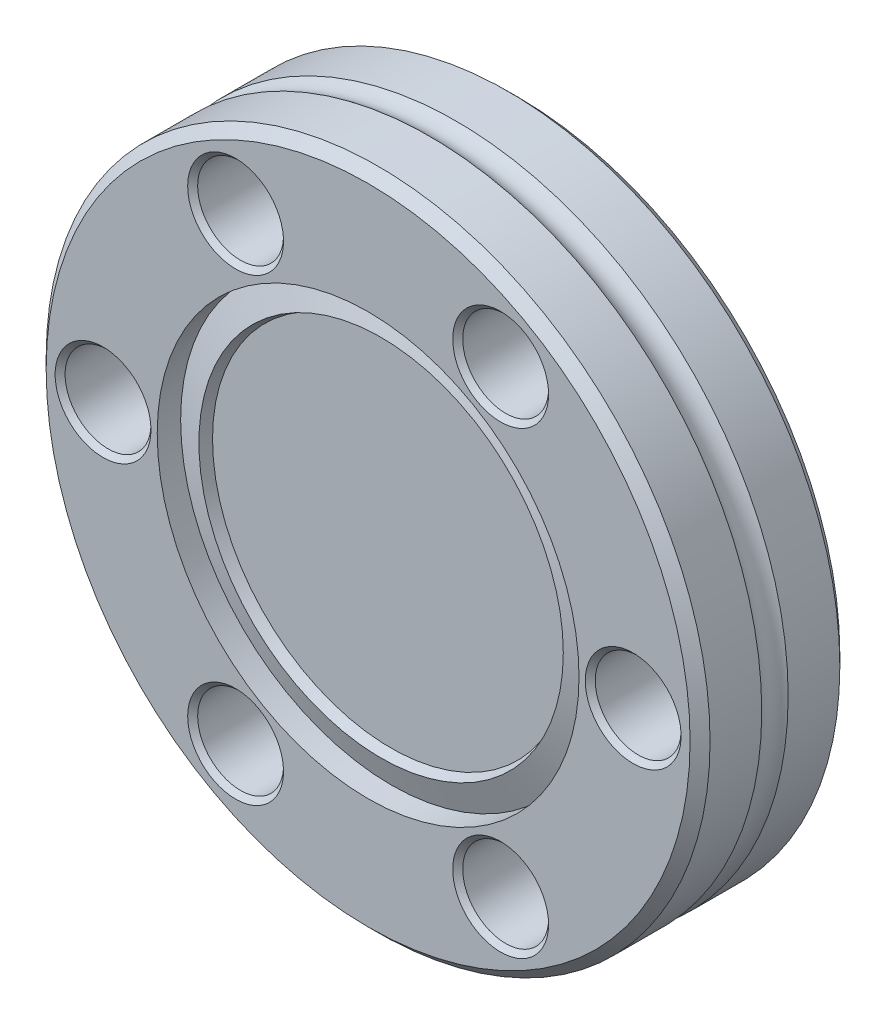
ISO-10303-21;
HEADER;
FILE_DESCRIPTION(('STEP AP214'),'2;1');
FILE_NAME('part.step','',(''),(''),'','','');
FILE_SCHEMA(('AUTOMOTIVE_DESIGN { 1 0 10303 214 1 1 1 1 }'));
ENDSEC;
DATA;
#1=APPLICATION_CONTEXT('core data for automotive mechanical design processes');
#2=APPLICATION_PROTOCOL_DEFINITION('international standard','automotive_design',2000,#1);
#3=PRODUCT_CONTEXT('',#1,'mechanical');
#4=PRODUCT('Part','Part','',(#3));
#5=PRODUCT_RELATED_PRODUCT_CATEGORY('part','',(#4));
#6=PRODUCT_DEFINITION_FORMATION('','',#4);
#7=PRODUCT_DEFINITION_CONTEXT('part definition',#1,'design');
#8=PRODUCT_DEFINITION('design','',#6,#7);
#9=PRODUCT_DEFINITION_SHAPE('','',#8);
#10=(LENGTH_UNIT() NAMED_UNIT(*) SI_UNIT(.MILLI.,.METRE.));
#11=(NAMED_UNIT(*) PLANE_ANGLE_UNIT() SI_UNIT($,.RADIAN.));
#12=(NAMED_UNIT(*) SI_UNIT($,.STERADIAN.) SOLID_ANGLE_UNIT());
#13=UNCERTAINTY_MEASURE_WITH_UNIT(LENGTH_MEASURE(1.E-05),#10,'distance_accuracy_value','');
#14=(GEOMETRIC_REPRESENTATION_CONTEXT(3) GLOBAL_UNCERTAINTY_ASSIGNED_CONTEXT((#13)) GLOBAL_UNIT_ASSIGNED_CONTEXT((#10,
#11,#12)) REPRESENTATION_CONTEXT('',''));
#15=CARTESIAN_POINT('',(0.,0.,0.));
#16=DIRECTION('',(0.,0.,1.));
#17=DIRECTION('',(1.,0.,0.));
#18=AXIS2_PLACEMENT_3D('',#15,#16,#17);
#19=CARTESIAN_POINT('',(6.7437,11.6804310310022,3.81));
#20=DIRECTION('',(0.,0.,1.));
#21=DIRECTION('',(0.5,0.866025403784439,0.));
#22=AXIS2_PLACEMENT_3D('',#19,#20,#21);
#23=CONICAL_SURFACE('',#22,2.4384,0.785398163397442);
#24=CARTESIAN_POINT('',(6.7437,11.6804310310022,3.556));
#25=DIRECTION('',(0.,0.,1.));
#26=DIRECTION('',(-0.5,-0.866025403784439,0.));
#27=AXIS2_PLACEMENT_3D('',#24,#25,#26);
#28=CIRCLE('',#27,2.1844);
#29=CARTESIAN_POINT('',(5.6515,9.78868513897552,3.556));
#30=VERTEX_POINT('',#29);
#31=EDGE_CURVE('E173',#30,#30,#28,.T.);
#32=ORIENTED_EDGE('',*,*,#31,.F.);
#33=EDGE_LOOP('',(#32));
#34=FACE_BOUND('',#33,.T.);
#35=CARTESIAN_POINT('',(6.7437,11.6804310310022,3.81));
#36=DIRECTION('',(0.,0.,-1.));
#37=DIRECTION('',(-0.5,-0.866025403784439,0.));
#38=AXIS2_PLACEMENT_3D('',#35,#36,#37);
#39=CIRCLE('',#38,2.4384);
#40=CARTESIAN_POINT('',(5.5245,9.56871468641427,3.81));
#41=VERTEX_POINT('',#40);
#42=EDGE_CURVE('E222',#41,#41,#39,.T.);
#43=ORIENTED_EDGE('',*,*,#42,.F.);
#44=EDGE_LOOP('',(#43));
#45=FACE_BOUND('',#44,.T.);
#46=ADVANCED_FACE('F16',(#34,#45),#23,.F.);
#47=CARTESIAN_POINT('',(-6.7437,11.6804310310022,48.3788326440397));
#48=DIRECTION('',(0.,0.,1.));
#49=DIRECTION('',(0.5,-0.866025403784439,0.));
#50=AXIS2_PLACEMENT_3D('',#47,#48,#49);
#51=CYLINDRICAL_SURFACE('',#50,2.1844);
#52=CARTESIAN_POINT('',(-6.7437,11.6804310310022,3.556));
#53=DIRECTION('',(0.,0.,1.));
#54=DIRECTION('',(0.5,-0.866025403784439,0.));
#55=AXIS2_PLACEMENT_3D('',#52,#53,#54);
#56=CIRCLE('',#55,2.1844);
#57=CARTESIAN_POINT('',(-5.6515,9.78868513897552,3.556));
#58=VERTEX_POINT('',#57);
#59=EDGE_CURVE('E25',#58,#58,#56,.T.);
#60=ORIENTED_EDGE('',*,*,#59,.T.);
#61=EDGE_LOOP('',(#60));
#62=FACE_BOUND('',#61,.T.);
#63=CARTESIAN_POINT('',(-6.7437,11.6804310310022,-3.556));
#64=DIRECTION('',(0.,0.,-1.));
#65=DIRECTION('',(0.5,-0.866025403784439,0.));
#66=AXIS2_PLACEMENT_3D('',#63,#64,#65);
#67=CIRCLE('',#66,2.1844);
#68=CARTESIAN_POINT('',(-5.6515,9.78868513897552,-3.556));
#69=VERTEX_POINT('',#68);
#70=EDGE_CURVE('E10',#69,#69,#67,.T.);
#71=ORIENTED_EDGE('',*,*,#70,.T.);
#72=EDGE_LOOP('',(#71));
#73=FACE_BOUND('',#72,.T.);
#74=ADVANCED_FACE('F325',(#62,#73),#51,.F.);
#75=CARTESIAN_POINT('',(-6.7437,11.6804310310022,-3.81));
#76=DIRECTION('',(0.,0.,-1.));
#77=DIRECTION('',(0.5,-0.866025403784439,0.));
#78=AXIS2_PLACEMENT_3D('',#75,#76,#77);
#79=CONICAL_SURFACE('',#78,2.4384,0.785398163397442);
#80=ORIENTED_EDGE('',*,*,#70,.F.);
#81=EDGE_LOOP('',(#80));
#82=FACE_BOUND('',#81,.T.);
#83=CARTESIAN_POINT('',(-6.7437,11.6804310310022,-3.81));
#84=DIRECTION('',(0.,0.,1.));
#85=DIRECTION('',(0.5,-0.866025403784439,0.));
#86=AXIS2_PLACEMENT_3D('',#83,#84,#85);
#87=CIRCLE('',#86,2.4384);
#88=CARTESIAN_POINT('',(-5.5245,9.56871468641427,-3.81));
#89=VERTEX_POINT('',#88);
#90=EDGE_CURVE('E192',#89,#89,#87,.T.);
#91=ORIENTED_EDGE('',*,*,#90,.F.);
#92=EDGE_LOOP('',(#91));
#93=FACE_BOUND('',#92,.T.);
#94=ADVANCED_FACE('F330',(#82,#93),#79,.F.);
#95=CARTESIAN_POINT('',(-6.7437,11.6804310310022,3.81));
#96=DIRECTION('',(0.,0.,1.));
#97=DIRECTION('',(-0.5,0.866025403784439,0.));
#98=AXIS2_PLACEMENT_3D('',#95,#96,#97);
#99=CONICAL_SURFACE('',#98,2.4384,0.785398163397442);
#100=ORIENTED_EDGE('',*,*,#59,.F.);
#101=EDGE_LOOP('',(#100));
#102=FACE_BOUND('',#101,.T.);
#103=CARTESIAN_POINT('',(-6.7437,11.6804310310022,3.81));
#104=DIRECTION('',(0.,0.,-1.));
#105=DIRECTION('',(0.5,-0.866025403784439,0.));
#106=AXIS2_PLACEMENT_3D('',#103,#104,#105);
#107=CIRCLE('',#106,2.4384);
#108=CARTESIAN_POINT('',(-5.5245,9.56871468641427,3.81));
#109=VERTEX_POINT('',#108);
#110=EDGE_CURVE('E226',#109,#109,#107,.T.);
#111=ORIENTED_EDGE('',*,*,#110,.F.);
#112=EDGE_LOOP('',(#111));
#113=FACE_BOUND('',#112,.T.);
#114=ADVANCED_FACE('F412',(#102,#113),#99,.F.);
#115=CARTESIAN_POINT('',(-13.4874,0.,48.3788326440397));
#116=DIRECTION('',(0.,0.,1.));
#117=DIRECTION('',(1.,0.,0.));
#118=AXIS2_PLACEMENT_3D('',#115,#116,#117);
#119=CYLINDRICAL_SURFACE('',#118,2.1844);
#120=CARTESIAN_POINT('',(-13.4874,0.,3.556));
#121=DIRECTION('',(0.,0.,1.));
#122=DIRECTION('',(1.,0.,0.));
#123=AXIS2_PLACEMENT_3D('',#120,#121,#122);
#124=CIRCLE('',#123,2.1844);
#125=CARTESIAN_POINT('',(-11.303,0.,3.556));
#126=VERTEX_POINT('',#125);
#127=EDGE_CURVE('E155',#126,#126,#124,.T.);
#128=ORIENTED_EDGE('',*,*,#127,.T.);
#129=EDGE_LOOP('',(#128));
#130=FACE_BOUND('',#129,.T.);
#131=CARTESIAN_POINT('',(-13.4874,0.,-3.556));
#132=DIRECTION('',(0.,0.,-1.));
#133=DIRECTION('',(1.,0.,0.));
#134=AXIS2_PLACEMENT_3D('',#131,#132,#133);
#135=CIRCLE('',#134,2.1844);
#136=CARTESIAN_POINT('',(-11.303,0.,-3.556));
#137=VERTEX_POINT('',#136);
#138=EDGE_CURVE('E151',#137,#137,#135,.T.);
#139=ORIENTED_EDGE('',*,*,#138,.T.);
#140=EDGE_LOOP('',(#139));
#141=FACE_BOUND('',#140,.T.);
#142=ADVANCED_FACE('F152',(#130,#141),#119,.F.);
#143=CARTESIAN_POINT('',(-13.4874,0.,-3.81));
#144=DIRECTION('',(0.,0.,-1.));
#145=DIRECTION('',(1.,0.,0.));
#146=AXIS2_PLACEMENT_3D('',#143,#144,#145);
#147=CONICAL_SURFACE('',#146,2.4384,0.785398163397442);
#148=ORIENTED_EDGE('',*,*,#138,.F.);
#149=EDGE_LOOP('',(#148));
#150=FACE_BOUND('',#149,.T.);
#151=CARTESIAN_POINT('',(-13.4874,0.,-3.81));
#152=DIRECTION('',(0.,0.,1.));
#153=DIRECTION('',(1.,0.,0.));
#154=AXIS2_PLACEMENT_3D('',#151,#152,#153);
#155=CIRCLE('',#154,2.4384);
#156=CARTESIAN_POINT('',(-11.049,0.,-3.81));
#157=VERTEX_POINT('',#156);
#158=EDGE_CURVE('E195',#157,#157,#155,.T.);
#159=ORIENTED_EDGE('',*,*,#158,.F.);
#160=EDGE_LOOP('',(#159));
#161=FACE_BOUND('',#160,.T.);
#162=ADVANCED_FACE('F420',(#150,#161),#147,.F.);
#163=CARTESIAN_POINT('',(-13.4874,0.,3.81));
#164=DIRECTION('',(0.,0.,1.));
#165=DIRECTION('',(-1.,0.,0.));
#166=AXIS2_PLACEMENT_3D('',#163,#164,#165);
#167=CONICAL_SURFACE('',#166,2.4384,0.785398163397442);
#168=ORIENTED_EDGE('',*,*,#127,.F.);
#169=EDGE_LOOP('',(#168));
#170=FACE_BOUND('',#169,.T.);
#171=CARTESIAN_POINT('',(-13.4874,0.,3.81));
#172=DIRECTION('',(0.,0.,-1.));
#173=DIRECTION('',(1.,0.,0.));
#174=AXIS2_PLACEMENT_3D('',#171,#172,#173);
#175=CIRCLE('',#174,2.4384);
#176=CARTESIAN_POINT('',(-11.049,0.,3.81));
#177=VERTEX_POINT('',#176);
#178=EDGE_CURVE('E223',#177,#177,#175,.T.);
#179=ORIENTED_EDGE('',*,*,#178,.F.);
#180=EDGE_LOOP('',(#179));
#181=FACE_BOUND('',#180,.T.);
#182=ADVANCED_FACE('F416',(#170,#181),#167,.F.);
#183=CARTESIAN_POINT('',(-6.7437,-11.6804310310022,48.3788326440397));
#184=DIRECTION('',(0.,0.,1.));
#185=DIRECTION('',(0.5,0.866025403784439,0.));
#186=AXIS2_PLACEMENT_3D('',#183,#184,#185);
#187=CYLINDRICAL_SURFACE('',#186,2.1844);
#188=CARTESIAN_POINT('',(-6.7437,-11.6804310310022,3.556));
#189=DIRECTION('',(0.,0.,1.));
#190=DIRECTION('',(0.5,0.866025403784439,0.));
#191=AXIS2_PLACEMENT_3D('',#188,#189,#190);
#192=CIRCLE('',#191,2.1844);
#193=CARTESIAN_POINT('',(-5.6515,-9.78868513897552,3.556));
#194=VERTEX_POINT('',#193);
#195=EDGE_CURVE('E166',#194,#194,#192,.T.);
#196=ORIENTED_EDGE('',*,*,#195,.T.);
#197=EDGE_LOOP('',(#196));
#198=FACE_BOUND('',#197,.T.);
#199=CARTESIAN_POINT('',(-6.7437,-11.6804310310022,-3.556));
#200=DIRECTION('',(0.,0.,-1.));
#201=DIRECTION('',(0.5,0.866025403784439,0.));
#202=AXIS2_PLACEMENT_3D('',#199,#200,#201);
#203=CIRCLE('',#202,2.1844);
#204=CARTESIAN_POINT('',(-5.6515,-9.78868513897552,-3.556));
#205=VERTEX_POINT('',#204);
#206=EDGE_CURVE('E160',#205,#205,#203,.T.);
#207=ORIENTED_EDGE('',*,*,#206,.T.);
#208=EDGE_LOOP('',(#207));
#209=FACE_BOUND('',#208,.T.);
#210=ADVANCED_FACE('F358',(#198,#209),#187,.F.);
#211=CARTESIAN_POINT('',(-6.7437,-11.6804310310022,-3.81));
#212=DIRECTION('',(0.,0.,-1.));
#213=DIRECTION('',(0.5,0.866025403784439,0.));
#214=AXIS2_PLACEMENT_3D('',#211,#212,#213);
#215=CONICAL_SURFACE('',#214,2.4384,0.785398163397442);
#216=ORIENTED_EDGE('',*,*,#206,.F.);
#217=EDGE_LOOP('',(#216));
#218=FACE_BOUND('',#217,.T.);
#219=CARTESIAN_POINT('',(-6.7437,-11.6804310310022,-3.81));
#220=DIRECTION('',(0.,0.,1.));
#221=DIRECTION('',(0.5,0.866025403784439,0.));
#222=AXIS2_PLACEMENT_3D('',#219,#220,#221);
#223=CIRCLE('',#222,2.4384);
#224=CARTESIAN_POINT('',(-5.5245,-9.56871468641427,-3.81));
#225=VERTEX_POINT('',#224);
#226=EDGE_CURVE('E198',#225,#225,#223,.T.);
#227=ORIENTED_EDGE('',*,*,#226,.F.);
#228=EDGE_LOOP('',(#227));
#229=FACE_BOUND('',#228,.T.);
#230=ADVANCED_FACE('F348',(#218,#229),#215,.F.);
#231=CARTESIAN_POINT('',(-6.7437,-11.6804310310022,3.81));
#232=DIRECTION('',(0.,0.,1.));
#233=DIRECTION('',(-0.5,-0.866025403784439,0.));
#234=AXIS2_PLACEMENT_3D('',#231,#232,#233);
#235=CONICAL_SURFACE('',#234,2.4384,0.785398163397442);
#236=ORIENTED_EDGE('',*,*,#195,.F.);
#237=EDGE_LOOP('',(#236));
#238=FACE_BOUND('',#237,.T.);
#239=CARTESIAN_POINT('',(-6.7437,-11.6804310310022,3.81));
#240=DIRECTION('',(0.,0.,-1.));
#241=DIRECTION('',(0.5,0.866025403784439,0.));
#242=AXIS2_PLACEMENT_3D('',#239,#240,#241);
#243=CIRCLE('',#242,2.4384);
#244=CARTESIAN_POINT('',(-5.5245,-9.56871468641427,3.81));
#245=VERTEX_POINT('',#244);
#246=EDGE_CURVE('E227',#245,#245,#243,.T.);
#247=ORIENTED_EDGE('',*,*,#246,.F.);
#248=EDGE_LOOP('',(#247));
#249=FACE_BOUND('',#248,.T.);
#250=ADVANCED_FACE('F345',(#238,#249),#235,.F.);
#251=CARTESIAN_POINT('',(0.,0.,-3.81));
#252=DIRECTION('',(0.,0.,1.));
#253=DIRECTION('',(1.,0.,0.));
#254=AXIS2_PLACEMENT_3D('',#251,#252,#253);
#255=CONICAL_SURFACE('',#254,16.383,0.785398163397449);
#256=CARTESIAN_POINT('',(0.,0.,-3.81));
#257=DIRECTION('',(0.,0.,-1.));
#258=DIRECTION('',(-1.,0.,0.));
#259=AXIS2_PLACEMENT_3D('',#256,#257,#258);
#260=CIRCLE('',#259,16.383);
#261=CARTESIAN_POINT('',(-16.383,0.,-3.81));
#262=VERTEX_POINT('',#261);
#263=EDGE_CURVE('E203',#262,#262,#260,.T.);
#264=ORIENTED_EDGE('',*,*,#263,.F.);
#265=EDGE_LOOP('',(#264));
#266=FACE_BOUND('',#265,.T.);
#267=CARTESIAN_POINT('',(0.,0.,-3.302));
#268=DIRECTION('',(0.,0.,1.));
#269=DIRECTION('',(-1.,0.,0.));
#270=AXIS2_PLACEMENT_3D('',#267,#268,#269);
#271=CIRCLE('',#270,16.891);
#272=CARTESIAN_POINT('',(-16.891,0.,-3.302));
#273=VERTEX_POINT('',#272);
#274=EDGE_CURVE('E262',#273,#273,#271,.T.);
#275=ORIENTED_EDGE('',*,*,#274,.F.);
#276=EDGE_LOOP('',(#275));
#277=FACE_BOUND('',#276,.T.);
#278=ADVANCED_FACE('F347',(#266,#277),#255,.T.);
#279=CARTESIAN_POINT('',(13.4874,0.,3.81));
#280=DIRECTION('',(0.,0.,1.));
#281=DIRECTION('',(1.,0.,0.));
#282=AXIS2_PLACEMENT_3D('',#279,#280,#281);
#283=CONICAL_SURFACE('',#282,2.4384,0.785398163397442);
#284=CARTESIAN_POINT('',(13.4874,0.,3.556));
#285=DIRECTION('',(0.,0.,1.));
#286=DIRECTION('',(-1.,0.,0.));
#287=AXIS2_PLACEMENT_3D('',#284,#285,#286);
#288=CIRCLE('',#287,2.1844);
#289=CARTESIAN_POINT('',(11.303,0.,3.556));
#290=VERTEX_POINT('',#289);
#291=EDGE_CURVE('E163',#290,#290,#288,.T.);
#292=ORIENTED_EDGE('',*,*,#291,.F.);
#293=EDGE_LOOP('',(#292));
#294=FACE_BOUND('',#293,.T.);
#295=CARTESIAN_POINT('',(13.4874,0.,3.81));
#296=DIRECTION('',(0.,0.,-1.));
#297=DIRECTION('',(-1.,0.,0.));
#298=AXIS2_PLACEMENT_3D('',#295,#296,#297);
#299=CIRCLE('',#298,2.4384);
#300=CARTESIAN_POINT('',(11.049,0.,3.81));
#301=VERTEX_POINT('',#300);
#302=EDGE_CURVE('E216',#301,#301,#299,.T.);
#303=ORIENTED_EDGE('',*,*,#302,.F.);
#304=EDGE_LOOP('',(#303));
#305=FACE_BOUND('',#304,.T.);
#306=ADVANCED_FACE('F355',(#294,#305),#283,.F.);
#307=CARTESIAN_POINT('',(13.4874,0.,48.3788326440397));
#308=DIRECTION('',(0.,0.,1.));
#309=DIRECTION('',(-1.,0.,0.));
#310=AXIS2_PLACEMENT_3D('',#307,#308,#309);
#311=CYLINDRICAL_SURFACE('',#310,2.1844);
#312=ORIENTED_EDGE('',*,*,#291,.T.);
#313=EDGE_LOOP('',(#312));
#314=FACE_BOUND('',#313,.T.);
#315=CARTESIAN_POINT('',(13.4874,0.,-3.556));
#316=DIRECTION('',(0.,0.,-1.));
#317=DIRECTION('',(-1.,0.,0.));
#318=AXIS2_PLACEMENT_3D('',#315,#316,#317);
#319=CIRCLE('',#318,2.1844);
#320=CARTESIAN_POINT('',(11.303,0.,-3.556));
#321=VERTEX_POINT('',#320);
#322=EDGE_CURVE('E237',#321,#321,#319,.T.);
#323=ORIENTED_EDGE('',*,*,#322,.T.);
#324=EDGE_LOOP('',(#323));
#325=FACE_BOUND('',#324,.T.);
#326=ADVANCED_FACE('F402',(#314,#325),#311,.F.);
#327=CARTESIAN_POINT('',(0.,0.,-2.6416));
#328=DIRECTION('',(0.,0.,1.));
#329=DIRECTION('',(1.,0.,0.));
#330=AXIS2_PLACEMENT_3D('',#327,#328,#329);
#331=PLANE('',#330);
#332=CARTESIAN_POINT('',(0.,0.,-2.6416));
#333=DIRECTION('',(0.,0.,-1.));
#334=DIRECTION('',(-1.,0.,0.));
#335=AXIS2_PLACEMENT_3D('',#332,#333,#334);
#336=CIRCLE('',#335,9.0861031209928);
#337=CARTESIAN_POINT('',(-9.0861031209928,0.,-2.6416));
#338=VERTEX_POINT('',#337);
#339=EDGE_CURVE('E167',#338,#338,#336,.T.);
#340=ORIENTED_EDGE('',*,*,#339,.T.);
#341=EDGE_LOOP('',(#340));
#342=FACE_BOUND('',#341,.T.);
#343=ADVANCED_FACE('F398',(#342),#331,.F.);
#344=CARTESIAN_POINT('',(0.,0.,-3.1496));
#345=DIRECTION('',(0.,0.,-1.));
#346=DIRECTION('',(-1.,0.,0.));
#347=AXIS2_PLACEMENT_3D('',#344,#345,#346);
#348=CONICAL_SURFACE('',#347,9.271,0.349065850398819);
#349=ORIENTED_EDGE('',*,*,#339,.F.);
#350=EDGE_LOOP('',(#349));
#351=FACE_BOUND('',#350,.T.);
#352=CARTESIAN_POINT('',(0.,0.,-3.1496));
#353=DIRECTION('',(0.,0.,-1.));
#354=DIRECTION('',(-1.,0.,0.));
#355=AXIS2_PLACEMENT_3D('',#352,#353,#354);
#356=CIRCLE('',#355,9.271);
#357=CARTESIAN_POINT('',(-9.271,0.,-3.1496));
#358=VERTEX_POINT('',#357);
#359=EDGE_CURVE('E170',#358,#358,#356,.T.);
#360=ORIENTED_EDGE('',*,*,#359,.T.);
#361=EDGE_LOOP('',(#360));
#362=FACE_BOUND('',#361,.T.);
#363=ADVANCED_FACE('F394',(#351,#362),#348,.F.);
#364=CARTESIAN_POINT('',(0.,0.,-2.61802147285421));
#365=DIRECTION('',(0.,0.,1.));
#366=DIRECTION('',(1.,0.,0.));
#367=AXIS2_PLACEMENT_3D('',#364,#365,#366);
#368=CONICAL_SURFACE('',#367,10.7315,1.22173047639603);
#369=ORIENTED_EDGE('',*,*,#359,.F.);
#370=EDGE_LOOP('',(#369));
#371=FACE_BOUND('',#370,.T.);
#372=CARTESIAN_POINT('',(0.,0.,-2.61802147285421));
#373=DIRECTION('',(0.,0.,-1.));
#374=DIRECTION('',(-1.,0.,0.));
#375=AXIS2_PLACEMENT_3D('',#372,#373,#374);
#376=CIRCLE('',#375,10.7315);
#377=CARTESIAN_POINT('',(-10.7315,0.,-2.61802147285421));
#378=VERTEX_POINT('',#377);
#379=EDGE_CURVE('E179',#378,#378,#376,.T.);
#380=ORIENTED_EDGE('',*,*,#379,.T.);
#381=EDGE_LOOP('',(#380));
#382=FACE_BOUND('',#381,.T.);
#383=ADVANCED_FACE('F390',(#371,#382),#368,.T.);
#384=CARTESIAN_POINT('',(6.7437,11.6804310310022,-3.81));
#385=DIRECTION('',(0.,0.,-1.));
#386=DIRECTION('',(-0.5,-0.866025403784439,0.));
#387=AXIS2_PLACEMENT_3D('',#384,#385,#386);
#388=CONICAL_SURFACE('',#387,2.4384,0.785398163397442);
#389=CARTESIAN_POINT('',(6.7437,11.6804310310022,-3.556));
#390=DIRECTION('',(0.,0.,-1.));
#391=DIRECTION('',(-0.5,-0.866025403784439,0.));
#392=AXIS2_PLACEMENT_3D('',#389,#390,#391);
#393=CIRCLE('',#392,2.1844);
#394=CARTESIAN_POINT('',(5.6515,9.78868513897552,-3.556));
#395=VERTEX_POINT('',#394);
#396=EDGE_CURVE('E176',#395,#395,#393,.T.);
#397=ORIENTED_EDGE('',*,*,#396,.F.);
#398=EDGE_LOOP('',(#397));
#399=FACE_BOUND('',#398,.T.);
#400=CARTESIAN_POINT('',(6.7437,11.6804310310022,-3.81));
#401=DIRECTION('',(0.,0.,1.));
#402=DIRECTION('',(-0.5,-0.866025403784439,0.));
#403=AXIS2_PLACEMENT_3D('',#400,#401,#402);
#404=CIRCLE('',#403,2.4384);
#405=CARTESIAN_POINT('',(5.5245,9.56871468641427,-3.81));
#406=VERTEX_POINT('',#405);
#407=EDGE_CURVE('E191',#406,#406,#404,.T.);
#408=ORIENTED_EDGE('',*,*,#407,.F.);
#409=EDGE_LOOP('',(#408));
#410=FACE_BOUND('',#409,.T.);
#411=ADVANCED_FACE('F387',(#399,#410),#388,.F.);
#412=CARTESIAN_POINT('',(6.7437,11.6804310310022,48.3788326440397));
#413=DIRECTION('',(0.,0.,1.));
#414=DIRECTION('',(-0.5,-0.866025403784439,0.));
#415=AXIS2_PLACEMENT_3D('',#412,#413,#414);
#416=CYLINDRICAL_SURFACE('',#415,2.1844);
#417=ORIENTED_EDGE('',*,*,#31,.T.);
#418=EDGE_LOOP('',(#417));
#419=FACE_BOUND('',#418,.T.);
#420=ORIENTED_EDGE('',*,*,#396,.T.);
#421=EDGE_LOOP('',(#420));
#422=FACE_BOUND('',#421,.T.);
#423=ADVANCED_FACE('F375',(#419,#422),#416,.F.);
#424=CARTESIAN_POINT('',(0.,0.,3.1496));
#425=DIRECTION('',(0.,0.,-1.));
#426=DIRECTION('',(-1.,0.,0.));
#427=AXIS2_PLACEMENT_3D('',#424,#425,#426);
#428=CONICAL_SURFACE('',#427,9.271,1.22173047639603);
#429=CARTESIAN_POINT('',(0.,0.,3.1496));
#430=DIRECTION('',(0.,0.,1.));
#431=DIRECTION('',(1.,0.,0.));
#432=AXIS2_PLACEMENT_3D('',#429,#430,#431);
#433=CIRCLE('',#432,9.271);
#434=CARTESIAN_POINT('',(9.271,0.,3.1496));
#435=VERTEX_POINT('',#434);
#436=EDGE_CURVE('E207',#435,#435,#433,.T.);
#437=ORIENTED_EDGE('',*,*,#436,.F.);
#438=EDGE_LOOP('',(#437));
#439=FACE_BOUND('',#438,.T.);
#440=CARTESIAN_POINT('',(0.,0.,2.61802147285421));
#441=DIRECTION('',(0.,0.,1.));
#442=DIRECTION('',(1.,0.,0.));
#443=AXIS2_PLACEMENT_3D('',#440,#441,#442);
#444=CIRCLE('',#443,10.7315);
#445=CARTESIAN_POINT('',(10.7315,0.,2.61802147285421));
#446=VERTEX_POINT('',#445);
#447=EDGE_CURVE('E182',#446,#446,#444,.T.);
#448=ORIENTED_EDGE('',*,*,#447,.T.);
#449=EDGE_LOOP('',(#448));
#450=FACE_BOUND('',#449,.T.);
#451=ADVANCED_FACE('F371',(#439,#450),#428,.T.);
#452=CARTESIAN_POINT('',(0.,0.,54.));
#453=DIRECTION('',(0.,0.,1.));
#454=DIRECTION('',(-1.,0.,0.));
#455=AXIS2_PLACEMENT_3D('',#452,#453,#454);
#456=CYLINDRICAL_SURFACE('',#455,10.7315);
#457=ORIENTED_EDGE('',*,*,#379,.F.);
#458=EDGE_LOOP('',(#457));
#459=FACE_BOUND('',#458,.T.);
#460=CARTESIAN_POINT('',(0.,0.,-3.81));
#461=DIRECTION('',(0.,0.,-1.));
#462=DIRECTION('',(-1.,0.,0.));
#463=AXIS2_PLACEMENT_3D('',#460,#461,#462);
#464=CIRCLE('',#463,10.7315);
#465=CARTESIAN_POINT('',(-10.7315,0.,-3.81));
#466=VERTEX_POINT('',#465);
#467=EDGE_CURVE('E188',#466,#466,#464,.T.);
#468=ORIENTED_EDGE('',*,*,#467,.T.);
#469=EDGE_LOOP('',(#468));
#470=FACE_BOUND('',#469,.T.);
#471=ADVANCED_FACE('F374',(#459,#470),#456,.F.);
#472=CARTESIAN_POINT('',(0.,0.,54.));
#473=DIRECTION('',(0.,0.,-1.));
#474=DIRECTION('',(1.,0.,0.));
#475=AXIS2_PLACEMENT_3D('',#472,#473,#474);
#476=CYLINDRICAL_SURFACE('',#475,10.7315);
#477=CARTESIAN_POINT('',(0.,0.,3.81));
#478=DIRECTION('',(0.,0.,1.));
#479=DIRECTION('',(1.,0.,0.));
#480=AXIS2_PLACEMENT_3D('',#477,#478,#479);
#481=CIRCLE('',#480,10.7315);
#482=CARTESIAN_POINT('',(10.7315,0.,3.81));
#483=VERTEX_POINT('',#482);
#484=EDGE_CURVE('E211',#483,#483,#481,.T.);
#485=ORIENTED_EDGE('',*,*,#484,.T.);
#486=EDGE_LOOP('',(#485));
#487=FACE_BOUND('',#486,.T.);
#488=ORIENTED_EDGE('',*,*,#447,.F.);
#489=EDGE_LOOP('',(#488));
#490=FACE_BOUND('',#489,.T.);
#491=ADVANCED_FACE('F379',(#487,#490),#476,.F.);
#492=CARTESIAN_POINT('',(6.7437,-11.6804310310023,48.3788326440397));
#493=DIRECTION('',(0.,0.,1.));
#494=DIRECTION('',(-0.5,0.866025403784439,0.));
#495=AXIS2_PLACEMENT_3D('',#492,#493,#494);
#496=CYLINDRICAL_SURFACE('',#495,2.1844);
#497=CARTESIAN_POINT('',(6.7437,-11.6804310310023,3.556));
#498=DIRECTION('',(0.,0.,1.));
#499=DIRECTION('',(-0.5,0.866025403784439,0.));
#500=AXIS2_PLACEMENT_3D('',#497,#498,#499);
#501=CIRCLE('',#500,2.1844);
#502=CARTESIAN_POINT('',(5.6515,-9.78868513897552,3.556));
#503=VERTEX_POINT('',#502);
#504=EDGE_CURVE('E257',#503,#503,#501,.T.);
#505=ORIENTED_EDGE('',*,*,#504,.T.);
#506=EDGE_LOOP('',(#505));
#507=FACE_BOUND('',#506,.T.);
#508=CARTESIAN_POINT('',(6.7437,-11.6804310310023,-3.556));
#509=DIRECTION('',(0.,0.,-1.));
#510=DIRECTION('',(-0.5,0.866025403784439,0.));
#511=AXIS2_PLACEMENT_3D('',#508,#509,#510);
#512=CIRCLE('',#511,2.1844);
#513=CARTESIAN_POINT('',(5.6515,-9.78868513897552,-3.556));
#514=VERTEX_POINT('',#513);
#515=EDGE_CURVE('E185',#514,#514,#512,.T.);
#516=ORIENTED_EDGE('',*,*,#515,.T.);
#517=EDGE_LOOP('',(#516));
#518=FACE_BOUND('',#517,.T.);
#519=ADVANCED_FACE('F276',(#507,#518),#496,.F.);
#520=CARTESIAN_POINT('',(6.7437,-11.6804310310023,-3.81));
#521=DIRECTION('',(0.,0.,-1.));
#522=DIRECTION('',(-0.5,0.866025403784439,0.));
#523=AXIS2_PLACEMENT_3D('',#520,#521,#522);
#524=CONICAL_SURFACE('',#523,2.4384,0.785398163397442);
#525=ORIENTED_EDGE('',*,*,#515,.F.);
#526=EDGE_LOOP('',(#525));
#527=FACE_BOUND('',#526,.T.);
#528=CARTESIAN_POINT('',(6.7437,-11.6804310310023,-3.81));
#529=DIRECTION('',(0.,0.,1.));
#530=DIRECTION('',(-0.5,0.866025403784439,0.));
#531=AXIS2_PLACEMENT_3D('',#528,#529,#530);
#532=CIRCLE('',#531,2.4384);
#533=CARTESIAN_POINT('',(5.5245,-9.56871468641428,-3.81));
#534=VERTEX_POINT('',#533);
#535=EDGE_CURVE('E201',#534,#534,#532,.T.);
#536=ORIENTED_EDGE('',*,*,#535,.F.);
#537=EDGE_LOOP('',(#536));
#538=FACE_BOUND('',#537,.T.);
#539=ADVANCED_FACE('F364',(#527,#538),#524,.F.);
#540=CARTESIAN_POINT('',(0.,0.,-3.81));
#541=DIRECTION('',(0.,0.,-1.));
#542=DIRECTION('',(0.,-1.,0.));
#543=AXIS2_PLACEMENT_3D('',#540,#541,#542);
#544=PLANE('',#543);
#545=ORIENTED_EDGE('',*,*,#467,.F.);
#546=EDGE_LOOP('',(#545));
#547=FACE_BOUND('',#546,.T.);
#548=CARTESIAN_POINT('',(13.4874,0.,-3.81));
#549=DIRECTION('',(0.,0.,1.));
#550=DIRECTION('',(-1.,0.,0.));
#551=AXIS2_PLACEMENT_3D('',#548,#549,#550);
#552=CIRCLE('',#551,2.4384);
#553=CARTESIAN_POINT('',(11.049,0.,-3.81));
#554=VERTEX_POINT('',#553);
#555=EDGE_CURVE('E241',#554,#554,#552,.T.);
#556=ORIENTED_EDGE('',*,*,#555,.T.);
#557=EDGE_LOOP('',(#556));
#558=FACE_BOUND('',#557,.T.);
#559=ORIENTED_EDGE('',*,*,#407,.T.);
#560=EDGE_LOOP('',(#559));
#561=FACE_BOUND('',#560,.T.);
#562=ORIENTED_EDGE('',*,*,#90,.T.);
#563=EDGE_LOOP('',(#562));
#564=FACE_BOUND('',#563,.T.);
#565=ORIENTED_EDGE('',*,*,#158,.T.);
#566=EDGE_LOOP('',(#565));
#567=FACE_BOUND('',#566,.T.);
#568=ORIENTED_EDGE('',*,*,#226,.T.);
#569=EDGE_LOOP('',(#568));
#570=FACE_BOUND('',#569,.T.);
#571=ORIENTED_EDGE('',*,*,#535,.T.);
#572=EDGE_LOOP('',(#571));
#573=FACE_BOUND('',#572,.T.);
#574=ORIENTED_EDGE('',*,*,#263,.T.);
#575=EDGE_LOOP('',(#574));
#576=FACE_BOUND('',#575,.T.);
#577=ADVANCED_FACE('F381',(#547,#558,#561,#564,#567,#570,#573,#576),#544,.T.);
#578=CARTESIAN_POINT('',(0.,0.,2.6416));
#579=DIRECTION('',(0.,0.,1.));
#580=DIRECTION('',(1.,0.,0.));
#581=AXIS2_PLACEMENT_3D('',#578,#579,#580);
#582=CONICAL_SURFACE('',#581,9.08610312099276,0.349065850398891);
#583=CARTESIAN_POINT('',(0.,0.,2.6416));
#584=DIRECTION('',(0.,0.,1.));
#585=DIRECTION('',(1.,0.,0.));
#586=AXIS2_PLACEMENT_3D('',#583,#584,#585);
#587=CIRCLE('',#586,9.08610312099276);
#588=CARTESIAN_POINT('',(9.08610312099276,0.,2.6416));
#589=VERTEX_POINT('',#588);
#590=EDGE_CURVE('E230',#589,#589,#587,.T.);
#591=ORIENTED_EDGE('',*,*,#590,.F.);
#592=EDGE_LOOP('',(#591));
#593=FACE_BOUND('',#592,.T.);
#594=ORIENTED_EDGE('',*,*,#436,.T.);
#595=EDGE_LOOP('',(#594));
#596=FACE_BOUND('',#595,.T.);
#597=ADVANCED_FACE('F297',(#593,#596),#582,.F.);
#598=CARTESIAN_POINT('',(0.,0.,3.81));
#599=DIRECTION('',(0.,0.,-1.));
#600=DIRECTION('',(0.,-1.,0.));
#601=AXIS2_PLACEMENT_3D('',#598,#599,#600);
#602=PLANE('',#601);
#603=ORIENTED_EDGE('',*,*,#484,.F.);
#604=EDGE_LOOP('',(#603));
#605=FACE_BOUND('',#604,.T.);
#606=ORIENTED_EDGE('',*,*,#302,.T.);
#607=EDGE_LOOP('',(#606));
#608=FACE_BOUND('',#607,.T.);
#609=ORIENTED_EDGE('',*,*,#42,.T.);
#610=EDGE_LOOP('',(#609));
#611=FACE_BOUND('',#610,.T.);
#612=ORIENTED_EDGE('',*,*,#110,.T.);
#613=EDGE_LOOP('',(#612));
#614=FACE_BOUND('',#613,.T.);
#615=ORIENTED_EDGE('',*,*,#178,.T.);
#616=EDGE_LOOP('',(#615));
#617=FACE_BOUND('',#616,.T.);
#618=ORIENTED_EDGE('',*,*,#246,.T.);
#619=EDGE_LOOP('',(#618));
#620=FACE_BOUND('',#619,.T.);
#621=CARTESIAN_POINT('',(6.7437,-11.6804310310023,3.81));
#622=DIRECTION('',(0.,0.,-1.));
#623=DIRECTION('',(-0.5,0.866025403784439,0.));
#624=AXIS2_PLACEMENT_3D('',#621,#622,#623);
#625=CIRCLE('',#624,2.4384);
#626=CARTESIAN_POINT('',(5.5245,-9.56871468641428,3.81));
#627=VERTEX_POINT('',#626);
#628=EDGE_CURVE('E258',#627,#627,#625,.T.);
#629=ORIENTED_EDGE('',*,*,#628,.T.);
#630=EDGE_LOOP('',(#629));
#631=FACE_BOUND('',#630,.T.);
#632=CARTESIAN_POINT('',(0.,0.,3.81));
#633=DIRECTION('',(0.,0.,1.));
#634=DIRECTION('',(-1.,0.,0.));
#635=AXIS2_PLACEMENT_3D('',#632,#633,#634);
#636=CIRCLE('',#635,16.383);
#637=CARTESIAN_POINT('',(-16.383,0.,3.81));
#638=VERTEX_POINT('',#637);
#639=EDGE_CURVE('E238',#638,#638,#636,.T.);
#640=ORIENTED_EDGE('',*,*,#639,.T.);
#641=EDGE_LOOP('',(#640));
#642=FACE_BOUND('',#641,.T.);
#643=ADVANCED_FACE('F293',(#605,#608,#611,#614,#617,#620,#631,#642),#602,.F.);
#644=CARTESIAN_POINT('',(0.,0.,2.6416));
#645=DIRECTION('',(0.,0.,1.));
#646=DIRECTION('',(1.,0.,0.));
#647=AXIS2_PLACEMENT_3D('',#644,#645,#646);
#648=PLANE('',#647);
#649=ORIENTED_EDGE('',*,*,#590,.T.);
#650=EDGE_LOOP('',(#649));
#651=FACE_BOUND('',#650,.T.);
#652=ADVANCED_FACE('F296',(#651),#648,.T.);
#653=CARTESIAN_POINT('',(0.,0.,3.81));
#654=DIRECTION('',(0.,0.,1.));
#655=DIRECTION('',(-1.,0.,0.));
#656=AXIS2_PLACEMENT_3D('',#653,#654,#655);
#657=CYLINDRICAL_SURFACE('',#656,16.891);
#658=CARTESIAN_POINT('',(0.,0.,3.302));
#659=DIRECTION('',(0.,0.,-1.));
#660=DIRECTION('',(-1.,0.,0.));
#661=AXIS2_PLACEMENT_3D('',#658,#659,#660);
#662=CIRCLE('',#661,16.891);
#663=CARTESIAN_POINT('',(-16.891,0.,3.302));
#664=VERTEX_POINT('',#663);
#665=EDGE_CURVE('E242',#664,#664,#662,.T.);
#666=ORIENTED_EDGE('',*,*,#665,.T.);
#667=EDGE_LOOP('',(#666));
#668=FACE_BOUND('',#667,.T.);
#669=CARTESIAN_POINT('',(0.,0.,0.67202083301042));
#670=DIRECTION('',(0.,0.,-1.));
#671=DIRECTION('',(-1.,0.,0.));
#672=AXIS2_PLACEMENT_3D('',#669,#670,#671);
#673=CIRCLE('',#672,16.891);
#674=CARTESIAN_POINT('',(-16.891,0.,0.67202083301042));
#675=VERTEX_POINT('',#674);
#676=EDGE_CURVE('E250',#675,#675,#673,.T.);
#677=ORIENTED_EDGE('',*,*,#676,.F.);
#678=EDGE_LOOP('',(#677));
#679=FACE_BOUND('',#678,.T.);
#680=ADVANCED_FACE('F309',(#668,#679),#657,.T.);
#681=CARTESIAN_POINT('',(13.4874,0.,-3.81));
#682=DIRECTION('',(0.,0.,-1.));
#683=DIRECTION('',(-1.,0.,0.));
#684=AXIS2_PLACEMENT_3D('',#681,#682,#683);
#685=CONICAL_SURFACE('',#684,2.4384,0.785398163397442);
#686=ORIENTED_EDGE('',*,*,#322,.F.);
#687=EDGE_LOOP('',(#686));
#688=FACE_BOUND('',#687,.T.);
#689=ORIENTED_EDGE('',*,*,#555,.F.);
#690=EDGE_LOOP('',(#689));
#691=FACE_BOUND('',#690,.T.);
#692=ADVANCED_FACE('F305',(#688,#691),#685,.F.);
#693=CARTESIAN_POINT('',(0.,0.,3.302));
#694=DIRECTION('',(0.,0.,-1.));
#695=DIRECTION('',(-1.,0.,0.));
#696=AXIS2_PLACEMENT_3D('',#693,#694,#695);
#697=CONICAL_SURFACE('',#696,16.891,0.78539816339745);
#698=ORIENTED_EDGE('',*,*,#639,.F.);
#699=EDGE_LOOP('',(#698));
#700=FACE_BOUND('',#699,.T.);
#701=ORIENTED_EDGE('',*,*,#665,.F.);
#702=EDGE_LOOP('',(#701));
#703=FACE_BOUND('',#702,.T.);
#704=ADVANCED_FACE('F302',(#700,#703),#697,.T.);
#705=CARTESIAN_POINT('',(0.,0.,0.));
#706=DIRECTION('',(0.,0.,-1.));
#707=DIRECTION('',(-1.,0.,0.));
#708=AXIS2_PLACEMENT_3D('',#705,#706,#707);
#709=TOROIDAL_SURFACE('',#708,17.653,1.016);
#710=CARTESIAN_POINT('',(0.,0.,-0.67202083301042));
#711=DIRECTION('',(0.,0.,-1.));
#712=DIRECTION('',(-1.,0.,0.));
#713=AXIS2_PLACEMENT_3D('',#710,#711,#712);
#714=CIRCLE('',#713,16.891);
#715=CARTESIAN_POINT('',(-16.891,0.,-0.67202083301042));
#716=VERTEX_POINT('',#715);
#717=EDGE_CURVE('E266',#716,#716,#714,.T.);
#718=ORIENTED_EDGE('',*,*,#717,.F.);
#719=EDGE_LOOP('',(#718));
#720=FACE_BOUND('',#719,.T.);
#721=ORIENTED_EDGE('',*,*,#676,.T.);
#722=EDGE_LOOP('',(#721));
#723=FACE_BOUND('',#722,.T.);
#724=ADVANCED_FACE('F286',(#720,#723),#709,.F.);
#725=CARTESIAN_POINT('',(6.7437,-11.6804310310023,3.81));
#726=DIRECTION('',(0.,0.,1.));
#727=DIRECTION('',(0.5,-0.866025403784439,0.));
#728=AXIS2_PLACEMENT_3D('',#725,#726,#727);
#729=CONICAL_SURFACE('',#728,2.4384,0.785398163397442);
#730=ORIENTED_EDGE('',*,*,#504,.F.);
#731=EDGE_LOOP('',(#730));
#732=FACE_BOUND('',#731,.T.);
#733=ORIENTED_EDGE('',*,*,#628,.F.);
#734=EDGE_LOOP('',(#733));
#735=FACE_BOUND('',#734,.T.);
#736=ADVANCED_FACE('F282',(#732,#735),#729,.F.);
#737=CARTESIAN_POINT('',(0.,0.,3.81));
#738=DIRECTION('',(0.,0.,1.));
#739=DIRECTION('',(-1.,0.,0.));
#740=AXIS2_PLACEMENT_3D('',#737,#738,#739);
#741=CYLINDRICAL_SURFACE('',#740,16.891);
#742=ORIENTED_EDGE('',*,*,#274,.T.);
#743=EDGE_LOOP('',(#742));
#744=FACE_BOUND('',#743,.T.);
#745=ORIENTED_EDGE('',*,*,#717,.T.);
#746=EDGE_LOOP('',(#745));
#747=FACE_BOUND('',#746,.T.);
#748=ADVANCED_FACE('F285',(#744,#747),#741,.T.);
#749=CLOSED_SHELL('',(#46,#74,#94,#114,#142,#162,#182,#210,#230,#250,#278,#306,#326,#343,#363,
#383,#411,#423,#451,#471,#491,#519,#539,#577,#597,#643,#652,#680,#692,#704,#724,#736,#748));
#750=MANIFOLD_SOLID_BREP('B1',#749);
#751=ADVANCED_BREP_SHAPE_REPRESENTATION('',(#18,#750),#14);
#752=SHAPE_DEFINITION_REPRESENTATION(#9,#751);
ENDSEC;
END-ISO-10303-21;
